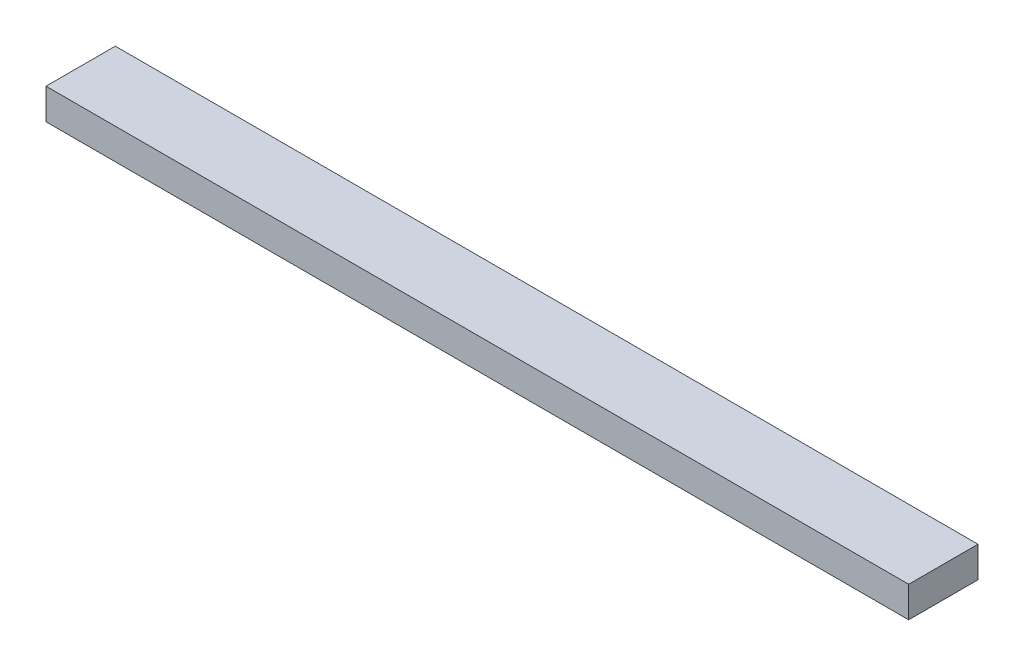
ISO-10303-21;
HEADER;
FILE_DESCRIPTION(('STEP AP214'),'2;1');
FILE_NAME('part.step','',(''),(''),'','','');
FILE_SCHEMA(('AUTOMOTIVE_DESIGN { 1 0 10303 214 1 1 1 1 }'));
ENDSEC;
DATA;
#1=APPLICATION_CONTEXT('core data for automotive mechanical design processes');
#2=APPLICATION_PROTOCOL_DEFINITION('international standard','automotive_design',2000,#1);
#3=PRODUCT_CONTEXT('',#1,'mechanical');
#4=PRODUCT('Part','Part','',(#3));
#5=PRODUCT_RELATED_PRODUCT_CATEGORY('part','',(#4));
#6=PRODUCT_DEFINITION_FORMATION('','',#4);
#7=PRODUCT_DEFINITION_CONTEXT('part definition',#1,'design');
#8=PRODUCT_DEFINITION('design','',#6,#7);
#9=PRODUCT_DEFINITION_SHAPE('','',#8);
#10=(LENGTH_UNIT() NAMED_UNIT(*) SI_UNIT(.MILLI.,.METRE.));
#11=(NAMED_UNIT(*) PLANE_ANGLE_UNIT() SI_UNIT($,.RADIAN.));
#12=(NAMED_UNIT(*) SI_UNIT($,.STERADIAN.) SOLID_ANGLE_UNIT());
#13=UNCERTAINTY_MEASURE_WITH_UNIT(LENGTH_MEASURE(1.E-05),#10,'distance_accuracy_value','');
#14=(GEOMETRIC_REPRESENTATION_CONTEXT(3) GLOBAL_UNCERTAINTY_ASSIGNED_CONTEXT((#13)) GLOBAL_UNIT_ASSIGNED_CONTEXT((#10,
#11,#12)) REPRESENTATION_CONTEXT('',''));
#15=CARTESIAN_POINT('',(0.,0.,0.));
#16=DIRECTION('',(0.,0.,1.));
#17=DIRECTION('',(1.,0.,0.));
#18=AXIS2_PLACEMENT_3D('',#15,#16,#17);
#19=CARTESIAN_POINT('',(-45.5408099717455,5.08,-30.608926487748));
#20=DIRECTION('',(1.,0.,0.));
#21=DIRECTION('',(0.,0.,-1.));
#22=AXIS2_PLACEMENT_3D('',#19,#20,#21);
#23=PLANE('',#22);
#24=DIRECTION('',(0.,0.,1.));
#25=VECTOR('',#24,1.);
#26=CARTESIAN_POINT('',(-45.5408099717455,0.,-30.608926487748));
#27=LINE('',#26,#25);
#28=CARTESIAN_POINT('',(-45.5408099717455,0.,-30.608926487748));
#29=VERTEX_POINT('',#28);
#30=CARTESIAN_POINT('',(-45.5408099717455,0.,-19.178926487748));
#31=VERTEX_POINT('',#30);
#32=EDGE_CURVE('E111',#29,#31,#27,.T.);
#33=ORIENTED_EDGE('',*,*,#32,.T.);
#34=DIRECTION('',(0.,-1.,0.));
#35=VECTOR('',#34,1.);
#36=CARTESIAN_POINT('',(-45.5408099717455,5.08,-19.178926487748));
#37=LINE('',#36,#35);
#38=CARTESIAN_POINT('',(-45.5408099717455,5.08,-19.178926487748));
#39=VERTEX_POINT('',#38);
#40=EDGE_CURVE('E11',#39,#31,#37,.T.);
#41=ORIENTED_EDGE('',*,*,#40,.F.);
#42=DIRECTION('',(0.,0.,1.));
#43=VECTOR('',#42,1.);
#44=CARTESIAN_POINT('',(-45.5408099717455,5.08,-30.608926487748));
#45=LINE('',#44,#43);
#46=CARTESIAN_POINT('',(-45.5408099717455,5.08,-30.608926487748));
#47=VERTEX_POINT('',#46);
#48=EDGE_CURVE('E95',#47,#39,#45,.T.);
#49=ORIENTED_EDGE('',*,*,#48,.F.);
#50=DIRECTION('',(0.,-1.,0.));
#51=VECTOR('',#50,1.);
#52=CARTESIAN_POINT('',(-45.5408099717455,5.08,-30.608926487748));
#53=LINE('',#52,#51);
#54=EDGE_CURVE('E107',#47,#29,#53,.T.);
#55=ORIENTED_EDGE('',*,*,#54,.T.);
#56=EDGE_LOOP('',(#33,#41,#49,#55));
#57=FACE_BOUND('',#56,.T.);
#58=ADVANCED_FACE('F43',(#57),#23,.F.);
#59=CARTESIAN_POINT('',(-45.5408099717455,5.08,-19.178926487748));
#60=DIRECTION('',(0.,0.,-1.));
#61=DIRECTION('',(-1.,0.,0.));
#62=AXIS2_PLACEMENT_3D('',#59,#60,#61);
#63=PLANE('',#62);
#64=DIRECTION('',(1.,0.,0.));
#65=VECTOR('',#64,1.);
#66=CARTESIAN_POINT('',(-45.5408099717455,0.,-19.178926487748));
#67=LINE('',#66,#65);
#68=CARTESIAN_POINT('',(96.6991900282545,0.,-19.178926487748));
#69=VERTEX_POINT('',#68);
#70=EDGE_CURVE('E100',#31,#69,#67,.T.);
#71=ORIENTED_EDGE('',*,*,#70,.T.);
#72=DIRECTION('',(0.,-1.,0.));
#73=VECTOR('',#72,1.);
#74=CARTESIAN_POINT('',(96.6991900282545,5.08,-19.178926487748));
#75=LINE('',#74,#73);
#76=CARTESIAN_POINT('',(96.6991900282545,5.08,-19.178926487748));
#77=VERTEX_POINT('',#76);
#78=EDGE_CURVE('E52',#77,#69,#75,.T.);
#79=ORIENTED_EDGE('',*,*,#78,.F.);
#80=DIRECTION('',(1.,0.,0.));
#81=VECTOR('',#80,1.);
#82=CARTESIAN_POINT('',(-45.5408099717455,5.08,-19.178926487748));
#83=LINE('',#82,#81);
#84=EDGE_CURVE('E90',#39,#77,#83,.T.);
#85=ORIENTED_EDGE('',*,*,#84,.F.);
#86=ORIENTED_EDGE('',*,*,#40,.T.);
#87=EDGE_LOOP('',(#71,#79,#85,#86));
#88=FACE_BOUND('',#87,.T.);
#89=ADVANCED_FACE('F99',(#88),#63,.F.);
#90=CARTESIAN_POINT('',(96.6991900282545,5.08,-30.608926487748));
#91=DIRECTION('',(-1.,0.,0.));
#92=DIRECTION('',(0.,0.,1.));
#93=AXIS2_PLACEMENT_3D('',#90,#91,#92);
#94=PLANE('',#93);
#95=DIRECTION('',(0.,0.,-1.));
#96=VECTOR('',#95,1.);
#97=CARTESIAN_POINT('',(96.6991900282545,0.,-30.608926487748));
#98=LINE('',#97,#96);
#99=CARTESIAN_POINT('',(96.6991900282545,0.,-30.608926487748));
#100=VERTEX_POINT('',#99);
#101=EDGE_CURVE('E77',#69,#100,#98,.T.);
#102=ORIENTED_EDGE('',*,*,#101,.T.);
#103=DIRECTION('',(0.,-1.,0.));
#104=VECTOR('',#103,1.);
#105=CARTESIAN_POINT('',(96.6991900282545,5.08,-30.608926487748));
#106=LINE('',#105,#104);
#107=CARTESIAN_POINT('',(96.6991900282545,5.08,-30.608926487748));
#108=VERTEX_POINT('',#107);
#109=EDGE_CURVE('E102',#108,#100,#106,.T.);
#110=ORIENTED_EDGE('',*,*,#109,.F.);
#111=DIRECTION('',(0.,0.,-1.));
#112=VECTOR('',#111,1.);
#113=CARTESIAN_POINT('',(96.6991900282545,5.08,-30.608926487748));
#114=LINE('',#113,#112);
#115=EDGE_CURVE('E93',#77,#108,#114,.T.);
#116=ORIENTED_EDGE('',*,*,#115,.F.);
#117=ORIENTED_EDGE('',*,*,#78,.T.);
#118=EDGE_LOOP('',(#102,#110,#116,#117));
#119=FACE_BOUND('',#118,.T.);
#120=ADVANCED_FACE('F103',(#119),#94,.F.);
#121=CARTESIAN_POINT('',(-45.5408099717455,5.08,-30.608926487748));
#122=DIRECTION('',(0.,0.,1.));
#123=DIRECTION('',(1.,0.,0.));
#124=AXIS2_PLACEMENT_3D('',#121,#122,#123);
#125=PLANE('',#124);
#126=DIRECTION('',(-1.,0.,0.));
#127=VECTOR('',#126,1.);
#128=CARTESIAN_POINT('',(-45.5408099717455,0.,-30.608926487748));
#129=LINE('',#128,#127);
#130=EDGE_CURVE('E83',#100,#29,#129,.T.);
#131=ORIENTED_EDGE('',*,*,#130,.T.);
#132=ORIENTED_EDGE('',*,*,#54,.F.);
#133=DIRECTION('',(-1.,0.,0.));
#134=VECTOR('',#133,1.);
#135=CARTESIAN_POINT('',(-45.5408099717455,5.08,-30.608926487748));
#136=LINE('',#135,#134);
#137=EDGE_CURVE('E60',#108,#47,#136,.T.);
#138=ORIENTED_EDGE('',*,*,#137,.F.);
#139=ORIENTED_EDGE('',*,*,#109,.T.);
#140=EDGE_LOOP('',(#131,#132,#138,#139));
#141=FACE_BOUND('',#140,.T.);
#142=ADVANCED_FACE('F124',(#141),#125,.F.);
#143=CARTESIAN_POINT('',(0.,5.08,0.));
#144=DIRECTION('',(0.,1.,0.));
#145=DIRECTION('',(0.,0.,1.));
#146=AXIS2_PLACEMENT_3D('',#143,#144,#145);
#147=PLANE('',#146);
#148=ORIENTED_EDGE('',*,*,#48,.T.);
#149=ORIENTED_EDGE('',*,*,#84,.T.);
#150=ORIENTED_EDGE('',*,*,#115,.T.);
#151=ORIENTED_EDGE('',*,*,#137,.T.);
#152=EDGE_LOOP('',(#148,#149,#150,#151));
#153=FACE_BOUND('',#152,.T.);
#154=ADVANCED_FACE('F91',(#153),#147,.T.);
#155=CARTESIAN_POINT('',(0.,0.,0.));
#156=DIRECTION('',(0.,1.,0.));
#157=DIRECTION('',(0.,0.,1.));
#158=AXIS2_PLACEMENT_3D('',#155,#156,#157);
#159=PLANE('',#158);
#160=ORIENTED_EDGE('',*,*,#32,.F.);
#161=ORIENTED_EDGE('',*,*,#130,.F.);
#162=ORIENTED_EDGE('',*,*,#101,.F.);
#163=ORIENTED_EDGE('',*,*,#70,.F.);
#164=EDGE_LOOP('',(#160,#161,#162,#163));
#165=FACE_BOUND('',#164,.T.);
#166=ADVANCED_FACE('F127',(#165),#159,.F.);
#167=CLOSED_SHELL('',(#58,#89,#120,#142,#154,#166));
#168=MANIFOLD_SOLID_BREP('B2',#167);
#169=ADVANCED_BREP_SHAPE_REPRESENTATION('',(#18,#168),#14);
#170=SHAPE_DEFINITION_REPRESENTATION(#9,#169);
ENDSEC;
END-ISO-10303-21;
